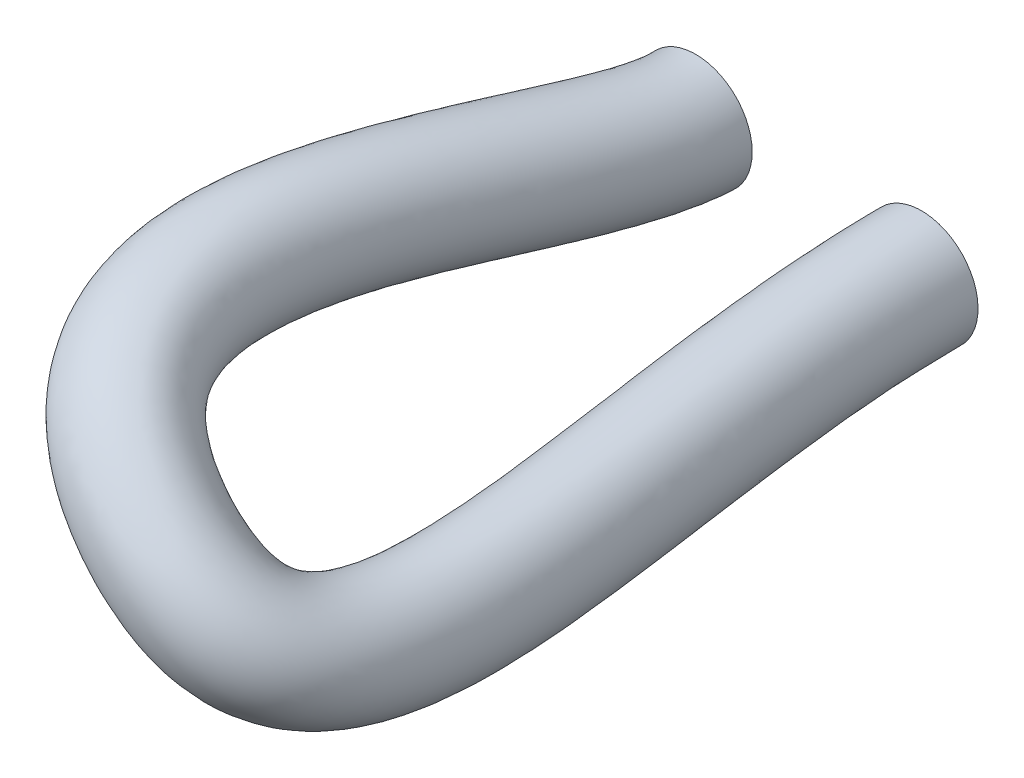
ISO-10303-21;
HEADER;
FILE_DESCRIPTION(('STEP AP214'),'2;1');
FILE_NAME('part.step','',(''),(''),'','','');
FILE_SCHEMA(('AUTOMOTIVE_DESIGN { 1 0 10303 214 1 1 1 1 }'));
ENDSEC;
DATA;
#1=APPLICATION_CONTEXT('core data for automotive mechanical design processes');
#2=APPLICATION_PROTOCOL_DEFINITION('international standard','automotive_design',2000,#1);
#3=PRODUCT_CONTEXT('',#1,'mechanical');
#4=PRODUCT('Part','Part','',(#3));
#5=PRODUCT_RELATED_PRODUCT_CATEGORY('part','',(#4));
#6=PRODUCT_DEFINITION_FORMATION('','',#4);
#7=PRODUCT_DEFINITION_CONTEXT('part definition',#1,'design');
#8=PRODUCT_DEFINITION('design','',#6,#7);
#9=PRODUCT_DEFINITION_SHAPE('','',#8);
#10=(LENGTH_UNIT() NAMED_UNIT(*) SI_UNIT(.MILLI.,.METRE.));
#11=(NAMED_UNIT(*) PLANE_ANGLE_UNIT() SI_UNIT($,.RADIAN.));
#12=(NAMED_UNIT(*) SI_UNIT($,.STERADIAN.) SOLID_ANGLE_UNIT());
#13=UNCERTAINTY_MEASURE_WITH_UNIT(LENGTH_MEASURE(1.E-05),#10,'distance_accuracy_value','');
#14=(GEOMETRIC_REPRESENTATION_CONTEXT(3) GLOBAL_UNCERTAINTY_ASSIGNED_CONTEXT((#13)) GLOBAL_UNIT_ASSIGNED_CONTEXT((#10,
#11,#12)) REPRESENTATION_CONTEXT('',''));
#15=CARTESIAN_POINT('',(0.,0.,0.));
#16=DIRECTION('',(0.,0.,1.));
#17=DIRECTION('',(1.,0.,0.));
#18=AXIS2_PLACEMENT_3D('',#15,#16,#17);
#19=CARTESIAN_POINT('',(3.,-2.49999999999999,-2.00000000000001));
#20=DIRECTION('',(0.,0.,-1.));
#21=DIRECTION('',(-0.180327868852458,0.983606557377049,0.));
#22=AXIS2_PLACEMENT_3D('',#19,#20,#21);
#23=PLANE('',#22);
#24=CARTESIAN_POINT('',(3.,-2.49999999999999,-2.00000000000001));
#25=DIRECTION('',(0.,0.,-1.));
#26=DIRECTION('',(-0.180327868852458,0.983606557377049,0.));
#27=AXIS2_PLACEMENT_3D('',#24,#25,#26);
#28=CIRCLE('',#27,1.);
#29=CARTESIAN_POINT('',(2.81967213114754,-1.51639344262295,-2.00000000000001));
#30=VERTEX_POINT('',#29);
#31=EDGE_CURVE('E85',#30,#30,#28,.T.);
#32=ORIENTED_EDGE('',*,*,#31,.F.);
#33=EDGE_LOOP('',(#32));
#34=FACE_BOUND('',#33,.T.);
#35=CARTESIAN_POINT('',(3.,-2.49999999999999,-2.00000000000001));
#36=DIRECTION('',(0.,0.,-1.));
#37=DIRECTION('',(-0.180327868852458,0.983606557377049,0.));
#38=AXIS2_PLACEMENT_3D('',#35,#36,#37);
#39=CIRCLE('',#38,1.25);
#40=CARTESIAN_POINT('',(2.77459016393442,-1.27049180327868,-2.00000000000001));
#41=VERTEX_POINT('',#40);
#42=EDGE_CURVE('E12',#41,#41,#39,.T.);
#43=ORIENTED_EDGE('',*,*,#42,.T.);
#44=EDGE_LOOP('',(#43));
#45=FACE_BOUND('',#44,.T.);
#46=ADVANCED_FACE('F75',(#34,#45),#23,.T.);
#47=CARTESIAN_POINT('',(0.,0.,0.));
#48=DIRECTION('',(0.,0.,1.));
#49=DIRECTION('',(1.,0.,0.));
#50=AXIS2_PLACEMENT_3D('',#47,#48,#49);
#51=PLANE('',#50);
#52=CARTESIAN_POINT('',(0.,0.,0.));
#53=DIRECTION('',(0.,0.,1.));
#54=DIRECTION('',(1.,0.,0.));
#55=AXIS2_PLACEMENT_3D('',#52,#53,#54);
#56=CIRCLE('',#55,1.);
#57=CARTESIAN_POINT('',(1.,0.,0.));
#58=VERTEX_POINT('',#57);
#59=EDGE_CURVE('E104',#58,#58,#56,.T.);
#60=ORIENTED_EDGE('',*,*,#59,.T.);
#61=EDGE_LOOP('',(#60));
#62=FACE_BOUND('',#61,.T.);
#63=CARTESIAN_POINT('',(0.,0.,0.));
#64=DIRECTION('',(0.,0.,1.));
#65=DIRECTION('',(1.,0.,0.));
#66=AXIS2_PLACEMENT_3D('',#63,#64,#65);
#67=CIRCLE('',#66,1.25);
#68=CARTESIAN_POINT('',(1.25,0.,0.));
#69=VERTEX_POINT('',#68);
#70=EDGE_CURVE('E108',#69,#69,#67,.T.);
#71=ORIENTED_EDGE('',*,*,#70,.F.);
#72=EDGE_LOOP('',(#71));
#73=FACE_BOUND('',#72,.T.);
#74=ADVANCED_FACE('F120',(#62,#73),#51,.F.);
#75=CARTESIAN_POINT('',(1.25,0.,0.));
#76=CARTESIAN_POINT('',(1.24020303916657,0.00816413402786144,0.768878568264969));
#77=CARTESIAN_POINT('',(0.898896629472732,0.292586142106055,2.84512273948862));
#78=CARTESIAN_POINT('',(0.294439810525157,0.796300157895701,5.64556326165292));
#79=CARTESIAN_POINT('',(0.0140658336581799,1.02994513861818,7.68135333235861));
#80=CARTESIAN_POINT('',(-0.0702243336616011,1.100186944718,8.92416247178356));
#81=CARTESIAN_POINT('',(-0.0233685751795636,1.0611404793163,10.0006141813896));
#82=CARTESIAN_POINT('',(0.132172860988602,0.931522615842832,10.6951014262284));
#83=CARTESIAN_POINT('',(0.318106707489525,0.77657774375873,11.1201394015434));
#84=CARTESIAN_POINT('',(0.490826787010012,0.632644344158323,11.3859831856266));
#85=CARTESIAN_POINT('',(0.708844428191528,0.450962976507059,11.6119329131336));
#86=CARTESIAN_POINT('',(0.903290219242124,0.28892481729823,11.7440949847972));
#87=CARTESIAN_POINT('',(1.12471727865323,0.104402267788971,11.8580686514309));
#88=CARTESIAN_POINT('',(1.37741199858499,-0.106176665487493,11.9585785213936));
#89=CARTESIAN_POINT('',(1.76774274302197,-0.431452285851649,12.0365356617491));
#90=CARTESIAN_POINT('',(2.13102806000967,-0.734190050008055,12.0455584944101));
#91=CARTESIAN_POINT('',(2.42374456354038,-0.978120469616982,12.0003935510488));
#92=CARTESIAN_POINT('',(2.57700874273462,-1.10584061894552,11.9425234383298));
#93=CARTESIAN_POINT('',(2.7053481946996,-1.21279016224967,11.8760800494708));
#94=CARTESIAN_POINT('',(2.81156937522793,-1.30130781268994,11.7981592128163));
#95=CARTESIAN_POINT('',(2.95083727723495,-1.41736439769579,11.6359995113662));
#96=CARTESIAN_POINT('',(3.08890691372569,-1.53242242810474,11.376211398493));
#97=CARTESIAN_POINT('',(3.2196966477306,-1.64141387310883,10.9557410714564));
#98=CARTESIAN_POINT('',(3.31663154335312,-1.72219295279427,10.3930045374812));
#99=CARTESIAN_POINT('',(3.42138870466577,-1.80949058722148,9.11555599234882));
#100=CARTESIAN_POINT('',(3.31768140073315,-1.7230678339443,6.58609779115926));
#101=CARTESIAN_POINT('',(2.9406986913543,-1.40891557612858,2.48729408804076));
#102=CARTESIAN_POINT('',(2.77577442028384,-1.27147868356987,-0.514281169093932));
#103=CARTESIAN_POINT('',(2.77459016393443,-1.27049180327869,-2.));
#104=CARTESIAN_POINT('',(1.25,-2.5,0.));
#105=CARTESIAN_POINT('',(1.22387477111084,-2.4782289759257,0.936517851373531));
#106=CARTESIAN_POINT('',(0.849911825305555,-2.16659318775463,3.34804058881431));
#107=CARTESIAN_POINT('',(0.259834477933916,-1.67486206494493,6.02780667160486));
#108=CARTESIAN_POINT('',(0.00319722116493777,-1.46099768430411,7.9090498032411));
#109=CARTESIAN_POINT('',(-0.0672084303151416,-1.40232630807072,8.97489174527888));
#110=CARTESIAN_POINT('',(-0.0262229950640643,-1.43648083744662,9.77366899613816));
#111=CARTESIAN_POINT('',(0.0621322790683926,-1.510110232557,10.1128310640162));
#112=CARTESIAN_POINT('',(0.10665713987183,-1.54721428322653,10.2055897758587));
#113=CARTESIAN_POINT('',(0.122428573150622,-1.56035714429219,10.2284676639448));
#114=CARTESIAN_POINT('',(0.145512677372495,-1.57959389781042,10.2541086937804));
#115=CARTESIAN_POINT('',(0.19475794622898,-1.62063162185749,10.2914541691684));
#116=CARTESIAN_POINT('',(0.284771546175593,-1.69564295514633,10.337261391775));
#117=CARTESIAN_POINT('',(0.414243357776562,-1.80353613148047,10.3909644679286));
#118=CARTESIAN_POINT('',(0.650160049363869,-2.0001333744699,10.4381608573673));
#119=CARTESIAN_POINT('',(0.849999004579342,-2.16666583714945,10.4420763458307));
#120=CARTESIAN_POINT('',(0.970900256124899,-2.26741688010408,10.4195906831583));
#121=CARTESIAN_POINT('',(0.969675001200082,-2.2663958343334,10.4152673267401));
#122=CARTESIAN_POINT('',(0.934324119355849,-2.23693676612988,10.4344287204243));
#123=CARTESIAN_POINT('',(0.86085630844649,-2.17571359037208,10.4828625593363));
#124=CARTESIAN_POINT('',(0.772327022238426,-2.10193918519869,10.5927876554624));
#125=CARTESIAN_POINT('',(0.754077887527748,-2.08673157293979,10.6469560459897));
#126=CARTESIAN_POINT('',(0.805181348079497,-2.12931779006625,10.505847367194));
#127=CARTESIAN_POINT('',(0.869154355028941,-2.18262862919079,10.1511859702122));
#128=CARTESIAN_POINT('',(0.954821648582511,-2.25401804048542,9.14791728189885));
#129=CARTESIAN_POINT('',(0.867908543074272,-2.1815904525619,6.7598365896531));
#130=CARTESIAN_POINT('',(0.487603579658757,-1.86466964971563,2.67043433304914));
#131=CARTESIAN_POINT('',(0.318731787423581,-1.72394315618632,-0.453234420757806));
#132=CARTESIAN_POINT('',(0.315573770491804,-1.72131147540983,-2.));
#133=CARTESIAN_POINT('',(-1.25,-2.5,0.));
#134=CARTESIAN_POINT('',(-1.25653130722229,-2.49455724398142,0.735350711643256));
#135=CARTESIAN_POINT('',(-1.59130640969384,-2.2155779919218,2.74453916962349));
#136=CARTESIAN_POINT('',(-2.1986391229566,-1.70946739753616,5.56911457966253));
#137=CARTESIAN_POINT('',(-2.48376044384317,-1.47186629679735,7.63581403818211));
#138=CARTESIAN_POINT('',(-2.5708275143309,-1.39931040472425,8.9140166170845));
#139=CARTESIAN_POINT('',(-2.52279769120267,-1.43933525733111,10.0460032184399));
#140=CARTESIAN_POINT('',(-2.35381902262736,-1.5801508144772,10.8115554986709));
#141=CARTESIAN_POINT('',(-2.13960337898694,-1.75866385084422,11.3030493266804));
#142=CARTESIAN_POINT('',(-1.93549357021811,-1.92875535815157,11.6174862899629));
#143=CARTESIAN_POINT('',(-1.67848922164467,-2.14292564862944,11.8834977570042));
#144=CARTESIAN_POINT('',(-1.45500332615525,-2.32916389487063,12.034623147923));
#145=CARTESIAN_POINT('',(-1.20729357485124,-2.53558868762397,12.1622301033621));
#146=CARTESIAN_POINT('',(-0.929954273253328,-2.76670477228889,12.2721013320866));
#147=CARTESIAN_POINT('',(-0.508740718246404,-3.117716068128,12.3562106226255));
#148=CARTESIAN_POINT('',(-0.112766128904267,-3.44769489257978,12.3662549241259));
#149=CARTESIAN_POINT('',(0.214313425023474,-3.72026118751956,12.3165541246269));
#150=CARTESIAN_POINT('',(0.398475491041527,-3.87372957586794,12.2479746606478));
#151=CARTESIAN_POINT('',(0.559553009768353,-4.00796084147363,12.1644103152802));
#152=CARTESIAN_POINT('',(0.701711988584213,-4.12642665715351,12.0612185435123));
#153=CARTESIAN_POINT('',(0.886539328234254,-4.28044944019521,11.844641882547));
#154=CARTESIAN_POINT('',(1.05587271896528,-4.42156059913773,11.5220624689936));
#155=CARTESIAN_POINT('',(1.20259970766082,-4.54383308971735,11.0457198123088));
#156=CARTESIAN_POINT('',(1.30612698101796,-4.63010581751497,10.4413682509349));
#157=CARTESIAN_POINT('',(1.41470211588242,-4.72058509656868,9.10908373443881));
#158=CARTESIAN_POINT('',(1.30763597226493,-4.63136331022078,6.55135003146048));
#159=CARTESIAN_POINT('',(0.931317713693406,-4.31776476141117,2.45066603903909));
#160=CARTESIAN_POINT('',(0.767182946855894,-4.18098578904658,-0.526490518761158));
#161=CARTESIAN_POINT('',(0.766393442622949,-4.18032786885246,-2.));
#162=CARTESIAN_POINT('',(-1.25,0.,0.));
#163=CARTESIAN_POINT('',(-1.24020303916657,-0.0081641340278612,0.567711428534694));
#164=CARTESIAN_POINT('',(-1.54232160552666,0.243601337938887,2.2416213202978));
#165=CARTESIAN_POINT('',(-2.16403379036536,0.76169482530447,5.18687116971059));
#166=CARTESIAN_POINT('',(-2.47289183134993,1.01907652612495,7.40811756729961));
#167=CARTESIAN_POINT('',(-2.57384341767736,1.10320284806447,8.86328734358919));
#168=CARTESIAN_POINT('',(-2.51994327131817,1.05828605943181,10.2729484036914));
#169=CARTESIAN_POINT('',(-2.28377844070715,0.861482033922632,11.3938258608831));
#170=CARTESIAN_POINT('',(-1.92815381136925,0.565128176141043,12.2175989523651));
#171=CARTESIAN_POINT('',(-1.56709535635872,0.26424613029894,12.7750018116447));
#172=CARTESIAN_POINT('',(-1.11515747082563,-0.112368774311967,13.2413219763573));
#173=CARTESIAN_POINT('',(-0.746471053142106,-0.419607455714909,13.4872639635517));
#174=CARTESIAN_POINT('',(-0.367347842373599,-0.735543464688665,13.6830373630179));
#175=CARTESIAN_POINT('',(0.0332143675550992,-1.06934530629591,13.8397153855516));
#176=CARTESIAN_POINT('',(0.608841975411702,-1.54903497950975,13.9545854270074));
#177=CARTESIAN_POINT('',(1.16826292652606,-2.01521910543838,13.9697370727053));
#178=CARTESIAN_POINT('',(1.66715773243895,-2.43096477703246,13.8973569925174));
#179=CARTESIAN_POINT('',(2.00580923257606,-2.71317436048005,13.7752307722375));
#180=CARTESIAN_POINT('',(2.3305770851121,-2.98381423759342,13.6060616443267));
#181=CARTESIAN_POINT('',(2.65242505536565,-3.25202087947138,13.3765151969923));
#182=CARTESIAN_POINT('',(3.06504958323078,-3.59587465269232,12.8878537384508));
#183=CARTESIAN_POINT('',(3.39070174516322,-3.86725145430269,12.2513178214969));
#184=CARTESIAN_POINT('',(3.61711500731192,-4.05592917275993,11.4956135165712));
#185=CARTESIAN_POINT('',(3.75360416934215,-4.16967014111846,10.6831868182039));
#186=CARTESIAN_POINT('',(3.88126917196568,-4.27605764330474,9.07672244488877));
#187=CARTESIAN_POINT('',(3.75740882992382,-4.17284069160318,6.37761123296665));
#188=CARTESIAN_POINT('',(3.38441282538895,-3.86201068782412,2.26752579403071));
#189=CARTESIAN_POINT('',(3.22422557971616,-3.72852131643013,-0.587537267097285));
#190=CARTESIAN_POINT('',(3.22540983606557,-3.72950819672131,-2.));
#191=CARTESIAN_POINT('',(-1.25,2.5,0.));
#192=CARTESIAN_POINT('',(-1.22387477111084,2.4782289759257,0.400072145426132));
#193=CARTESIAN_POINT('',(-1.49333680135948,2.70278066779958,1.73870347097211));
#194=CARTESIAN_POINT('',(-2.12942845777412,3.23285704814511,4.80462775975865));
#195=CARTESIAN_POINT('',(-2.46202321885669,3.51001934904725,7.18042109641712));
#196=CARTESIAN_POINT('',(-2.57685932102382,3.60571610085319,8.81255807009388));
#197=CARTESIAN_POINT('',(-2.51708885143367,3.55590737619473,10.4998935889428));
#198=CARTESIAN_POINT('',(-2.21373785878694,3.30311488232246,11.9760962230953));
#199=CARTESIAN_POINT('',(-1.71670424375155,2.8889202031263,13.1321485780498));
#200=CARTESIAN_POINT('',(-1.19869714249933,2.45724761874945,13.9325173333266));
#201=CARTESIAN_POINT('',(-0.551825720006602,1.91818810000551,14.5991461957105));
#202=CARTESIAN_POINT('',(-0.0379387801289622,1.48994898344081,14.9399047791805));
#203=CARTESIAN_POINT('',(0.472597890104043,1.06450175824664,15.2038446226738));
#204=CARTESIAN_POINT('',(0.996383008363526,0.628014159697069,15.4073294390165));
#205=CARTESIAN_POINT('',(1.72642466906981,0.0196461091085027,15.5529602313892));
#206=CARTESIAN_POINT('',(2.44929198195638,-0.58274331829699,15.5732192212847));
#207=CARTESIAN_POINT('',(3.12000203985443,-1.14166836654536,15.4781598604079));
#208=CARTESIAN_POINT('',(3.6131429741106,-1.55261914509217,15.3024868838272));
#209=CARTESIAN_POINT('',(4.10160116045586,-1.95966763371321,15.0477129733733));
#210=CARTESIAN_POINT('',(4.60313812214708,-2.37761510178924,14.6918118504724));
#211=CARTESIAN_POINT('',(5.2435598382273,-2.91129986518942,13.9310655943547));
#212=CARTESIAN_POINT('',(5.72553077136116,-3.31294230946764,12.9805731740001));
#213=CARTESIAN_POINT('',(6.03163030696302,-3.56802525580252,11.9455072208335));
#214=CARTESIAN_POINT('',(6.20108135766633,-3.70923446472194,10.9250053854729));
#215=CARTESIAN_POINT('',(6.34783622804894,-3.83153019004079,9.04436115533874));
#216=CARTESIAN_POINT('',(6.2071816875827,-3.71431807298558,6.2038724344728));
#217=CARTESIAN_POINT('',(5.83750793708448,-3.40625661423707,2.08438554902233));
#218=CARTESIAN_POINT('',(5.68126821257642,-3.27605684381368,-0.648584015433411));
#219=CARTESIAN_POINT('',(5.68442622950819,-3.27868852459017,-2.));
#220=CARTESIAN_POINT('',(1.25,2.5,0.));
#221=CARTESIAN_POINT('',(1.25653130722229,2.49455724398142,0.601239285156407));
#222=CARTESIAN_POINT('',(0.947881433639909,2.75176547196675,2.34220489016294));
#223=CARTESIAN_POINT('',(0.329045143116398,3.26746238073634,5.26331985170098));
#224=CARTESIAN_POINT('',(0.024934446151422,3.52088796154048,7.45365686147611));
#225=CARTESIAN_POINT('',(-0.0732402370080603,3.60270019750672,8.87343319828825));
#226=CARTESIAN_POINT('',(-0.0205141552950631,3.55876179607922,10.2275593666411));
#227=CARTESIAN_POINT('',(0.202213442908811,3.37315546424266,11.2773717884406));
#228=CARTESIAN_POINT('',(0.529556275107219,3.10036977074399,12.0346890272282));
#229=CARTESIAN_POINT('',(0.859225000869402,2.82564583260883,12.5434987073084));
#230=CARTESIAN_POINT('',(1.27217617901056,2.48151985082454,12.9697571324867));
#231=CARTESIAN_POINT('',(1.61182249225527,2.19848125645395,13.196735800426));
#232=CARTESIAN_POINT('',(1.96466301113088,1.90444749072427,13.3788759110868));
#233=CARTESIAN_POINT('',(2.34058063939341,1.59118280050549,13.5261925748586));
#234=CARTESIAN_POINT('',(2.88532543668008,1.1372288027666,13.634910466131));
#235=CARTESIAN_POINT('',(3.41205711543999,0.698285737133338,13.6490406429895));
#236=CARTESIAN_POINT('',(3.87658887095586,0.311175940870117,13.5811964189393));
#237=CARTESIAN_POINT('',(4.18434248426915,0.05471459644237,13.4697795499195));
#238=CARTESIAN_POINT('',(4.47637227004335,-0.188643558369462,13.3177313785174));
#239=CARTESIAN_POINT('',(4.76228244200936,-0.426902035007801,13.1134558662963));
#240=CARTESIAN_POINT('',(5.12934753223147,-0.732789610192894,12.6792113672701));
#241=CARTESIAN_POINT('',(5.42373593992363,-0.978113283269694,12.1054667509962));
#242=CARTESIAN_POINT('',(5.6342119473817,-1.15350995615142,11.4056347757187));
#243=CARTESIAN_POINT('',(5.76410873167731,-1.26175727639776,10.6348231047501));
#244=CARTESIAN_POINT('',(5.88795576074903,-1.36496313395753,9.08319470279878));
#245=CARTESIAN_POINT('',(5.76745425839204,-1.2645452153267,6.41235899266541));
#246=CARTESIAN_POINT('',(5.39379380304984,-0.953161502541533,2.30415384303238));
#247=CARTESIAN_POINT('',(5.2328170531441,-0.819014210953421,-0.575327917430059));
#248=CARTESIAN_POINT('',(5.23360655737705,-0.819672131147543,-2.));
#249=CARTESIAN_POINT('',(1.25,0.,0.));
#250=CARTESIAN_POINT('',(1.24020303916657,0.00816413402786144,0.768878568264969));
#251=CARTESIAN_POINT('',(0.898896629472732,0.292586142106055,2.84512273948862));
#252=CARTESIAN_POINT('',(0.294439810525157,0.796300157895701,5.64556326165292));
#253=CARTESIAN_POINT('',(0.0140658336581799,1.02994513861818,7.68135333235861));
#254=CARTESIAN_POINT('',(-0.0702243336616011,1.100186944718,8.92416247178356));
#255=CARTESIAN_POINT('',(-0.0233685751795636,1.0611404793163,10.0006141813896));
#256=CARTESIAN_POINT('',(0.132172860988602,0.931522615842832,10.6951014262284));
#257=CARTESIAN_POINT('',(0.318106707489525,0.77657774375873,11.1201394015434));
#258=CARTESIAN_POINT('',(0.490826787010012,0.632644344158323,11.3859831856266));
#259=CARTESIAN_POINT('',(0.708844428191528,0.450962976507059,11.6119329131336));
#260=CARTESIAN_POINT('',(0.903290219242124,0.28892481729823,11.7440949847972));
#261=CARTESIAN_POINT('',(1.12471727865323,0.104402267788971,11.8580686514309));
#262=CARTESIAN_POINT('',(1.37741199858499,-0.106176665487493,11.9585785213936));
#263=CARTESIAN_POINT('',(1.76774274302197,-0.431452285851649,12.0365356617491));
#264=CARTESIAN_POINT('',(2.13102806000967,-0.734190050008055,12.0455584944101));
#265=CARTESIAN_POINT('',(2.42374456354038,-0.978120469616982,12.0003935510488));
#266=CARTESIAN_POINT('',(2.57700874273462,-1.10584061894552,11.9425234383298));
#267=CARTESIAN_POINT('',(2.7053481946996,-1.21279016224967,11.8760800494708));
#268=CARTESIAN_POINT('',(2.81156937522793,-1.30130781268994,11.7981592128163));
#269=CARTESIAN_POINT('',(2.95083727723495,-1.41736439769579,11.6359995113662));
#270=CARTESIAN_POINT('',(3.08890691372569,-1.53242242810474,11.376211398493));
#271=CARTESIAN_POINT('',(3.2196966477306,-1.64141387310883,10.9557410714564));
#272=CARTESIAN_POINT('',(3.31663154335312,-1.72219295279427,10.3930045374812));
#273=CARTESIAN_POINT('',(3.42138870466577,-1.80949058722148,9.11555599234882));
#274=CARTESIAN_POINT('',(3.31768140073315,-1.7230678339443,6.58609779115926));
#275=CARTESIAN_POINT('',(2.9406986913543,-1.40891557612858,2.48729408804076));
#276=CARTESIAN_POINT('',(2.77577442028384,-1.27147868356987,-0.514281169093932));
#277=CARTESIAN_POINT('',(2.77459016393443,-1.27049180327869,-2.));
#278=(BOUNDED_SURFACE() B_SPLINE_SURFACE(3,3,((#75,#76,#77,#78,#79,#80,#81,#82,#83,#84,#85,#86,
#87,#88,#89,#90,#91,#92,#93,#94,#95,#96,#97,#98,#99,#100,#101,#102,#103),(#104,#105,#106,#107,
#108,#109,#110,#111,#112,#113,#114,#115,#116,#117,#118,#119,#120,#121,#122,#123,#124,#125,#126,
#127,#128,#129,#130,#131,#132),(#133,#134,#135,#136,#137,#138,#139,#140,#141,#142,#143,#144,
#145,#146,#147,#148,#149,#150,#151,#152,#153,#154,#155,#156,#157,#158,#159,#160,#161),(#162,
#163,#164,#165,#166,#167,#168,#169,#170,#171,#172,#173,#174,#175,#176,#177,#178,#179,#180,#181,
#182,#183,#184,#185,#186,#187,#188,#189,#190),(#191,#192,#193,#194,#195,#196,#197,#198,#199,
#200,#201,#202,#203,#204,#205,#206,#207,#208,#209,#210,#211,#212,#213,#214,#215,#216,#217,#218,
#219),(#220,#221,#222,#223,#224,#225,#226,#227,#228,#229,#230,#231,#232,#233,#234,#235,#236,
#237,#238,#239,#240,#241,#242,#243,#244,#245,#246,#247,#248),(#249,#250,#251,#252,#253,#254,
#255,#256,#257,#258,#259,#260,#261,#262,#263,#264,#265,#266,#267,#268,#269,#270,#271,#272,#273,
#274,#275,#276,#277)),.UNSPECIFIED.,.T.,.F.,.F.) B_SPLINE_SURFACE_WITH_KNOTS((4,3,4),(4,1,1,1,1,
1,1,1,1,1,1,1,1,1,1,1,1,1,1,1,1,1,1,1,1,1,4),(0.,0.5,1.),(0.,0.118125,0.23625,0.28265625,
0.329062499999999,0.37546875,0.421874999999912,0.4453125,0.468750000000011,0.4921875,0.515625,
0.51722955361672,0.5390625,0.5625,0.581249999999996,0.6,0.61722955361672,0.61875,0.6375,0.65625,
0.679687500000002,0.703125,0.726562500000153,0.750000000000002,0.833333333333333,
0.916666666666667,1.),
.UNSPECIFIED.) GEOMETRIC_REPRESENTATION_ITEM() RATIONAL_B_SPLINE_SURFACE(((1.,1.,1.,1.,1.,1.,1.,
1.,1.,1.,1.,1.,1.,1.,1.,1.,1.,1.,1.,0.999999999999999,1.,1.,1.,1.,1.,1.,1.,1.,1.),
(0.333333333333333,0.333333333333333,0.333333333333333,0.333333333333333,0.333333333333333,
0.333333333333333,0.333333333333333,0.333333333333333,0.333333333333333,0.333333333333333,
0.333333333333333,0.333333333333333,0.333333333333333,0.333333333333333,0.333333333333333,
0.333333333333333,0.333333333333333,0.333333333333333,0.333333333333333,0.333333333333333,
0.333333333333333,0.333333333333333,0.333333333333333,0.333333333333333,0.333333333333333,
0.333333333333333,0.333333333333333,0.333333333333333,0.333333333333333),(0.333333333333333,
0.333333333333333,0.333333333333333,0.333333333333333,0.333333333333333,0.333333333333333,
0.333333333333333,0.333333333333333,0.333333333333333,0.333333333333333,0.333333333333333,
0.333333333333333,0.333333333333333,0.333333333333333,0.333333333333333,0.333333333333333,
0.333333333333333,0.333333333333333,0.333333333333333,0.333333333333333,0.333333333333333,
0.333333333333333,0.333333333333333,0.333333333333333,0.333333333333333,0.333333333333333,
0.333333333333333,0.333333333333333,0.333333333333333),(1.,1.,1.,1.,1.,1.,1.,1.,1.,1.,1.,1.,1.,
1.,1.,1.,1.,1.,1.,0.999999999999999,1.,1.,1.,1.,1.,1.,1.,1.,1.),(0.333333333333333,
0.333333333333333,0.333333333333333,0.333333333333333,0.333333333333333,0.333333333333333,
0.333333333333333,0.333333333333333,0.333333333333333,0.333333333333333,0.333333333333333,
0.333333333333333,0.333333333333333,0.333333333333333,0.333333333333333,0.333333333333333,
0.333333333333333,0.333333333333333,0.333333333333333,0.333333333333333,0.333333333333333,
0.333333333333333,0.333333333333333,0.333333333333333,0.333333333333333,0.333333333333333,
0.333333333333333,0.333333333333333,0.333333333333333),(0.333333333333333,0.333333333333333,
0.333333333333333,0.333333333333333,0.333333333333333,0.333333333333333,0.333333333333333,
0.333333333333333,0.333333333333333,0.333333333333333,0.333333333333333,0.333333333333333,
0.333333333333333,0.333333333333333,0.333333333333333,0.333333333333333,0.333333333333333,
0.333333333333333,0.333333333333333,0.333333333333333,0.333333333333333,0.333333333333333,
0.333333333333333,0.333333333333333,0.333333333333333,0.333333333333333,0.333333333333333,
0.333333333333333,0.333333333333333),(1.,1.,1.,1.,1.,1.,1.,1.,1.,1.,1.,1.,1.,1.,1.,1.,1.,1.,1.,
0.999999999999999,1.,1.,1.,1.,1.,1.,1.,1.,1.))) REPRESENTATION_ITEM('') SURFACE());
#279=CARTESIAN_POINT('',(1.25,0.,0.));
#280=CARTESIAN_POINT('',(1.24020303916657,0.00816413402786144,0.768878568264969));
#281=CARTESIAN_POINT('',(0.898896629472732,0.292586142106055,2.84512273948862));
#282=CARTESIAN_POINT('',(0.294439810525157,0.796300157895701,5.64556326165292));
#283=CARTESIAN_POINT('',(0.0140658336581799,1.02994513861818,7.68135333235861));
#284=CARTESIAN_POINT('',(-0.0702243336616011,1.100186944718,8.92416247178356));
#285=CARTESIAN_POINT('',(-0.0233685751795636,1.0611404793163,10.0006141813896));
#286=CARTESIAN_POINT('',(0.132172860988602,0.931522615842832,10.6951014262284));
#287=CARTESIAN_POINT('',(0.318106707489525,0.77657774375873,11.1201394015434));
#288=CARTESIAN_POINT('',(0.490826787010012,0.632644344158323,11.3859831856266));
#289=CARTESIAN_POINT('',(0.708844428191528,0.450962976507059,11.6119329131336));
#290=CARTESIAN_POINT('',(0.903290219242124,0.28892481729823,11.7440949847972));
#291=CARTESIAN_POINT('',(1.12471727865323,0.104402267788971,11.8580686514309));
#292=CARTESIAN_POINT('',(1.37741199858499,-0.106176665487493,11.9585785213936));
#293=CARTESIAN_POINT('',(1.76774274302197,-0.431452285851649,12.0365356617491));
#294=CARTESIAN_POINT('',(2.13102806000967,-0.734190050008055,12.0455584944101));
#295=CARTESIAN_POINT('',(2.42374456354038,-0.978120469616982,12.0003935510488));
#296=CARTESIAN_POINT('',(2.57700874273462,-1.10584061894552,11.9425234383298));
#297=CARTESIAN_POINT('',(2.7053481946996,-1.21279016224967,11.8760800494708));
#298=CARTESIAN_POINT('',(2.81156937522793,-1.30130781268994,11.7981592128163));
#299=CARTESIAN_POINT('',(2.95083727723495,-1.41736439769579,11.6359995113662));
#300=CARTESIAN_POINT('',(3.08890691372569,-1.53242242810474,11.376211398493));
#301=CARTESIAN_POINT('',(3.2196966477306,-1.64141387310883,10.9557410714564));
#302=CARTESIAN_POINT('',(3.31663154335312,-1.72219295279427,10.3930045374812));
#303=CARTESIAN_POINT('',(3.42138870466577,-1.80949058722148,9.11555599234882));
#304=CARTESIAN_POINT('',(3.31768140073315,-1.7230678339443,6.58609779115926));
#305=CARTESIAN_POINT('',(2.9406986913543,-1.40891557612858,2.48729408804076));
#306=CARTESIAN_POINT('',(2.77577442028384,-1.27147868356987,-0.514281169093932));
#307=CARTESIAN_POINT('',(2.77459016393443,-1.27049180327869,-2.));
#308=B_SPLINE_CURVE_WITH_KNOTS('',3,(#279,#280,#281,#282,#283,#284,#285,#286,#287,#288,#289,
#290,#291,#292,#293,#294,#295,#296,#297,#298,#299,#300,#301,#302,#303,#304,#305,#306,#307),
.UNSPECIFIED.,.F.,.F.,(4,1,1,1,1,1,1,1,1,1,1,1,1,1,1,1,1,1,1,1,1,1,1,1,1,1,4),(0.,0.118125,
0.23625,0.28265625,0.329062499999999,0.37546875,0.421874999999912,0.4453125,0.468750000000011,
0.4921875,0.515625,0.51722955361672,0.5390625,0.5625,0.581249999999996,0.6,0.61722955361672,
0.61875,0.6375,0.65625,0.679687500000002,0.703125,0.726562500000153,0.750000000000002,
0.833333333333333,0.916666666666667,1.),.UNSPECIFIED.);
#309=EDGE_CURVE('E78',#69,#41,#308,.T.);
#310=ORIENTED_EDGE('',*,*,#70,.T.);
#311=ORIENTED_EDGE('',*,*,#309,.T.);
#312=ORIENTED_EDGE('',*,*,#42,.F.);
#313=ORIENTED_EDGE('',*,*,#309,.F.);
#314=EDGE_LOOP('',(#310,#311,#312,#313));
#315=FACE_BOUND('',#314,.T.);
#316=ADVANCED_FACE('F118',(#315),#278,.F.);
#317=CARTESIAN_POINT('',(1.,0.,0.));
#318=CARTESIAN_POINT('',(0.992162431333253,0.00653130722228919,0.748761854291941));
#319=CARTESIAN_POINT('',(0.654774805972792,0.287687661689339,2.78477259756954));
#320=CARTESIAN_POINT('',(0.0485924504361055,0.792839624636578,5.59969405245869));
#321=CARTESIAN_POINT('',(-0.234629932842632,1.02885827736886,7.65402975585271));
#322=CARTESIAN_POINT('',(-0.320586242063177,1.10048853505265,8.91807495896413));
#323=CARTESIAN_POINT('',(-0.273026044793424,1.06085503732785,10.0278476036198));
#324=CARTESIAN_POINT('',(-0.109422269180974,0.924518557650812,10.7649738696939));
#325=CARTESIAN_POINT('',(0.0934806556036475,0.755432786996961,11.2298853566256));
#326=CARTESIAN_POINT('',(0.285034572673139,0.595804522772384,11.5248850482284));
#327=CARTESIAN_POINT('',(0.526444238289812,0.394629801425157,11.774871819456));
#328=CARTESIAN_POINT('',(0.738314092003701,0.218071589996916,11.9184118826727));
#329=CARTESIAN_POINT('',(0.975510766550551,0.0204076945412074,12.0405655225896));
#330=CARTESIAN_POINT('',(1.242992235482,-0.202493529568335,12.1466922078094));
#331=CARTESIAN_POINT('',(1.65185266626095,-0.543210555217459,12.2283406382749));
#332=CARTESIAN_POINT('',(2.03475154666131,-0.862292955551088,12.2379763522396));
#333=CARTESIAN_POINT('',(2.34808588043024,-1.12340490035853,12.1900898951957));
#334=CARTESIAN_POINT('',(2.51988879171876,-1.26657399309897,12.1257941717206));
#335=CARTESIAN_POINT('',(2.66787108374085,-1.38989256978404,12.0490782089564));
#336=CARTESIAN_POINT('',(2.7956549432417,-1.49637911936808,11.9559948112339));
#337=CARTESIAN_POINT('',(2.96225850783453,-1.63521542319544,11.7611849340747));
#338=CARTESIAN_POINT('',(3.11908639686944,-1.76590533072454,11.4637220407934));
#339=CARTESIAN_POINT('',(3.25943848368873,-1.88286540307394,11.0097283159678));
#340=CARTESIAN_POINT('',(3.36032880595203,-1.96694067162669,10.4220227655534));
#341=CARTESIAN_POINT('',(3.46737675139576,-2.0561472928298,9.11167263760281));
#342=CARTESIAN_POINT('',(3.36165414365222,-1.96804511971019,6.56524913534));
#343=CARTESIAN_POINT('',(2.98507010475776,-1.65422508729814,2.46531725863976));
#344=CARTESIAN_POINT('',(2.82061953622707,-1.51718294685589,-0.521606778894267));
#345=CARTESIAN_POINT('',(2.81967213114754,-1.51639344262295,-2.));
#346=CARTESIAN_POINT('',(1.,-2.,0.));
#347=CARTESIAN_POINT('',(0.979099816888672,-1.98258318074056,0.882873280778791));
#348=CARTESIAN_POINT('',(0.615586962639051,-1.67965580219921,3.18710687703009));
#349=CARTESIAN_POINT('',(0.0209081843631124,-1.18409015363593,5.90548878042024));
#350=CARTESIAN_POINT('',(-0.243324822837225,-0.963895980968979,7.8361869325587));
#351=CARTESIAN_POINT('',(-0.318173519386009,-0.901522067178329,8.95865837776038));
#352=CARTESIAN_POINT('',(-0.275309580701025,-0.937242016082481,9.84629145541863));
#353=CARTESIAN_POINT('',(-0.165454734717141,-1.02878772106905,10.2991575799241));
#354=CARTESIAN_POINT('',(-0.075678998490508,-1.10360083459124,10.4982456560778));
#355=CARTESIAN_POINT('',(-0.00968399841437314,-1.15859666798802,10.598872630883));
#356=CARTESIAN_POINT('',(0.0757788376345854,-1.22981569802882,10.6886124439734));
#357=CARTESIAN_POINT('',(0.171488273593186,-1.30957356132766,10.7562992301696));
#358=CARTESIAN_POINT('',(0.303554180568438,-1.41962848380703,10.8239197148649));
#359=CARTESIAN_POINT('',(0.472457322835259,-1.56038110236272,10.8926009650374));
#360=CARTESIAN_POINT('',(0.757786511334463,-1.79815542611206,10.9496407947695));
#361=CARTESIAN_POINT('',(1.00992830231705,-2.0082735852642,10.9551906333761));
#362=CARTESIAN_POINT('',(1.18581043449785,-2.15484202874821,10.9254476008833));
#363=CARTESIAN_POINT('',(1.23402179849113,-2.19501816540928,10.9039892824488));
#364=CARTESIAN_POINT('',(1.25105182346585,-2.20920985288821,10.8957571457192));
#365=CARTESIAN_POINT('',(1.23508448981655,-2.19590374151379,10.9037574884499));
#366=CARTESIAN_POINT('',(1.21945030383731,-2.18287525319776,10.9266154493516));
#367=CARTESIAN_POINT('',(1.25122317591109,-2.20935264659258,10.8803177587908));
#368=CARTESIAN_POINT('',(1.32782624396785,-2.27318853663987,10.649813352558));
#369=CARTESIAN_POINT('',(1.40234705529268,-2.3352892127439,10.2285679117383));
#370=CARTESIAN_POINT('',(1.49412310652915,-2.41176925544096,9.13756166924284));
#371=CARTESIAN_POINT('',(1.40183585752512,-2.33486321460427,6.70424017413507));
#372=CARTESIAN_POINT('',(1.02259401540133,-2.01882834616778,2.61182945464646));
#373=CARTESIAN_POINT('',(0.854985429938864,-1.87915452494905,-0.472769380225366));
#374=CARTESIAN_POINT('',(0.852459016393443,-1.87704918032787,-2.));
#375=CARTESIAN_POINT('',(-1.,-2.,0.));
#376=CARTESIAN_POINT('',(-1.00522504577783,-1.99564579518514,0.721939568994571));
#377=CARTESIAN_POINT('',(-1.33738762536046,-1.71884364553295,2.70430574167743));
#378=CARTESIAN_POINT('',(-1.9458706963493,-1.21177441970892,5.53853510686638));
#379=CARTESIAN_POINT('',(-2.23289095484371,-0.972590870963568,7.61759832051151));
#380=CARTESIAN_POINT('',(-2.32106878659862,-0.899109344501153,8.90995827520488));
#381=CARTESIAN_POINT('',(-2.27256933761191,-0.939525551990075,10.06415883326));
#382=CARTESIAN_POINT('',(-2.09821577607374,-1.08482018660521,10.8581371276478));
#383=CARTESIAN_POINT('',(-1.87268741357752,-1.27276048868539,11.3762132967352));
#384=CARTESIAN_POINT('',(-1.65602171310936,-1.45331523907553,11.7100875316975));
#385=CARTESIAN_POINT('',(-1.38342268157914,-1.68048109868404,11.9921236945525));
#386=CARTESIAN_POINT('',(-1.1483207443142,-1.87639937973817,12.1508344131733));
#387=CARTESIAN_POINT('',(-0.890097916253029,-2.09158506978914,12.2838946841345));
#388=CARTESIAN_POINT('',(-0.602900781988653,-2.33091601500946,12.3975104563638));
#389=CARTESIAN_POINT('',(-0.169334102753756,-2.69222158103854,12.4840806069761));
#390=CARTESIAN_POINT('',(0.239716195530159,-3.03309682960846,12.4945334960123));
#391=CARTESIAN_POINT('',(0.580540969616712,-3.31711747468059,12.4430183540581));
#392=CARTESIAN_POINT('',(0.77706219036429,-3.48088515863691,12.370155149575));
#393=CARTESIAN_POINT('',(0.951234935795852,-3.62602911316321,12.2797424216039));
#394=CARTESIAN_POINT('',(1.10776903392673,-3.75647419493894,12.1664422757907));
#395=CARTESIAN_POINT('',(1.31082014863398,-3.92568345719498,11.9280988310193));
#396=CARTESIAN_POINT('',(1.49265904106111,-4.07721586755093,11.5804028971939));
#397=CARTESIAN_POINT('',(1.6457609316329,-4.20480077636075,11.0817113086498));
#398=CARTESIAN_POINT('',(1.7519251560839,-4.29327096340325,10.4607137363165));
#399=CARTESIAN_POINT('',(1.86202748036908,-4.38502290030757,9.10649483127481));
#400=CARTESIAN_POINT('',(1.75361780087764,-4.29468150073137,6.53745092758098));
#401=CARTESIAN_POINT('',(1.37756532262905,-3.98130443552421,2.43601481943842));
#402=CARTESIAN_POINT('',(1.21374635748471,-3.84478863123726,-0.531374258628048));
#403=CARTESIAN_POINT('',(1.21311475409836,-3.84426229508197,-2.));
#404=CARTESIAN_POINT('',(-1.,0.,0.));
#405=CARTESIAN_POINT('',(-0.992162431333253,-0.00653130722228897,0.587828142507721));
#406=CARTESIAN_POINT('',(-1.29819978202672,0.248499818355604,2.30197146221688));
#407=CARTESIAN_POINT('',(-1.91818643027631,0.765155358563594,5.23274037890482));
#408=CARTESIAN_POINT('',(-2.22419606484912,1.02016338737427,7.43544114380551));
#409=CARTESIAN_POINT('',(-2.32348150927578,1.10290125772982,8.86937485640863));
#410=CARTESIAN_POINT('',(-2.27028580170431,1.05857150142026,10.2457149814612));
#411=CARTESIAN_POINT('',(-2.04218331053758,0.868486092114652,11.3239534174176));
#412=CARTESIAN_POINT('',(-1.70352775948337,0.586273132902811,12.1078529972829));
#413=CARTESIAN_POINT('',(-1.36130314202185,0.301085951684879,12.6360999490429));
#414=CARTESIAN_POINT('',(-0.932757280923918,-0.0560355992300642,13.078383070035));
#415=CARTESIAN_POINT('',(-0.581494925903683,-0.348754228413595,13.3129470656763));
#416=CARTESIAN_POINT('',(-0.218141330270915,-0.651548891440902,13.5005404918592));
#417=CARTESIAN_POINT('',(0.167634130658088,-0.973028442215071,13.6516016991358));
#418=CARTESIAN_POINT('',(0.724732052172729,-1.43727671014394,13.7627804504815));
#419=CARTESIAN_POINT('',(1.26453943987442,-1.88711619989535,13.7773192148758));
#420=CARTESIAN_POINT('',(1.7428164155491,-2.28568034629091,13.7076606483705));
#421=CARTESIAN_POINT('',(2.06292918359192,-2.5524409863266,13.5919600388467));
#422=CARTESIAN_POINT('',(2.36805419607085,-2.80671183005905,13.4330634848411));
#423=CARTESIAN_POINT('',(2.66833948735188,-3.05694957279323,13.2186795985748));
#424=CARTESIAN_POINT('',(3.05362835263119,-3.37802362719266,12.7626683157424));
#425=CARTESIAN_POINT('',(3.36052226201947,-3.63376855168289,12.1638071791965));
#426=CARTESIAN_POINT('',(3.57737317135378,-3.81447764279482,11.4416262720597));
#427=CARTESIAN_POINT('',(3.70990690674325,-3.92492242228604,10.6541685901316));
#428=CARTESIAN_POINT('',(3.83528112523569,-4.02940093769641,9.08060579963478));
#429=CARTESIAN_POINT('',(3.71343608700475,-3.92786340583729,6.3984598887859));
#430=CARTESIAN_POINT('',(3.34004141198548,-3.61670117665457,2.28950262343171));
#431=CARTESIAN_POINT('',(3.17938046377292,-3.4828170531441,-0.580211657296949));
#432=CARTESIAN_POINT('',(3.18032786885246,-3.48360655737705,-2.));
#433=CARTESIAN_POINT('',(-1.,2.,0.));
#434=CARTESIAN_POINT('',(-0.979099816888672,1.98258318074056,0.453716716020872));
#435=CARTESIAN_POINT('',(-1.25901193869298,2.21584328224416,1.89963718275633));
#436=CARTESIAN_POINT('',(-1.89050216420332,2.7420851368361,4.92694565094327));
#437=CARTESIAN_POINT('',(-2.21550117485453,3.01291764571211,7.25328396709952));
#438=CARTESIAN_POINT('',(-2.32589423195295,3.1049118599608,8.82879143761238));
#439=CARTESIAN_POINT('',(-2.26800226579671,3.0566685548306,10.4272711296624));
#440=CARTESIAN_POINT('',(-1.98615084500141,2.82179237083451,11.7897697071874));
#441=CARTESIAN_POINT('',(-1.53436810538921,2.44530675449102,12.8394926978307));
#442=CARTESIAN_POINT('',(-1.06658457093434,2.05548714244529,13.5621123663884));
#443=CARTESIAN_POINT('',(-0.482091880268692,1.56840990022392,14.1646424455175));
#444=CARTESIAN_POINT('',(-0.014669107493168,1.17889092291098,14.4750597181793));
#445=CARTESIAN_POINT('',(0.453815255711198,0.78848728690734,14.7171862995839));
#446=CARTESIAN_POINT('',(0.938169043304829,0.384859130579315,14.9056929419077));
#447=CARTESIAN_POINT('',(1.61879820709921,-0.182331839249337,15.041480293987));
#448=CARTESIAN_POINT('',(2.28936268421868,-0.741135570182236,15.0601049337393));
#449=CARTESIAN_POINT('',(2.90509186148148,-1.25424321790123,14.9723029426829));
#450=CARTESIAN_POINT('',(3.34879617681955,-1.62399681401629,14.8137649281185));
#451=CARTESIAN_POINT('',(3.78487345634586,-1.98739454695488,14.5863845480784));
#452=CARTESIAN_POINT('',(4.22890994077702,-2.35742495064752,14.2709169213587));
#453=CARTESIAN_POINT('',(4.79643655662841,-2.83036379719034,13.5972378004655));
#454=CARTESIAN_POINT('',(5.22838548297782,-3.19032123581485,12.7472114611991));
#455=CARTESIAN_POINT('',(5.50898541107466,-3.42415450922889,11.8015412354696));
#456=CARTESIAN_POINT('',(5.66788865740259,-3.55657388116883,10.8476234439468));
#457=CARTESIAN_POINT('',(5.8085347701023,-3.67377897508525,9.05471676799475));
#458=CARTESIAN_POINT('',(5.67325437313186,-3.56104531094321,6.25946884999083));
#459=CARTESIAN_POINT('',(5.30251750134191,-3.25209791778493,2.14299042742501));
#460=CARTESIAN_POINT('',(5.14501457006113,-3.12084547505095,-0.62904905596585));
#461=CARTESIAN_POINT('',(5.14754098360656,-3.12295081967213,-2.));
#462=CARTESIAN_POINT('',(1.,2.,0.));
#463=CARTESIAN_POINT('',(1.00522504577783,1.99564579518514,0.614650427805092));
#464=CARTESIAN_POINT('',(0.693962649306534,2.25503112557789,2.38243831810899));
#465=CARTESIAN_POINT('',(0.076276716509098,2.76976940290909,5.29389932449714));
#466=CARTESIAN_POINT('',(-0.225935042848038,3.0216125357067,7.47187257914671));
#467=CARTESIAN_POINT('',(-0.322998964740344,3.10249913728362,8.87749154016788));
#468=CARTESIAN_POINT('',(-0.270742508885824,3.05895209073819,10.209403751821));
#469=CARTESIAN_POINT('',(-0.0533898036448065,2.87782483637067,11.2307901594637));
#470=CARTESIAN_POINT('',(0.262640309697803,2.61446640858517,11.9615250571734));
#471=CARTESIAN_POINT('',(0.579753143760651,2.35020571353279,12.4508974655738));
#472=CARTESIAN_POINT('',(0.977109638945038,2.01907530087914,12.8611311949385));
#473=CARTESIAN_POINT('',(1.30513991041422,1.74571674132149,13.0805245351757));
#474=CARTESIAN_POINT('',(1.64746735253266,1.46044387288945,13.2572113303143));
#475=CARTESIAN_POINT('',(2.01352714812874,1.15539404322605,13.4007834505814));
#476=CARTESIAN_POINT('',(2.54591882118743,0.711734315677141,13.5070404817804));
#477=CARTESIAN_POINT('',(3.05957479100557,0.283687674162026,13.5207620711031));
#478=CARTESIAN_POINT('',(3.51036132636262,-0.0919677719688501,13.454732189508));
#479=CARTESIAN_POINT('',(3.80575578494639,-0.338129820788661,13.3475990609924));
#480=CARTESIAN_POINT('',(4.08469034401585,-0.570575286679878,13.2023992721937));
#481=CARTESIAN_POINT('',(4.35622539666685,-0.796854497222373,13.0082321340179));
#482=CARTESIAN_POINT('',(4.70506671183175,-1.08755559319313,12.5957544187978));
#483=CARTESIAN_POINT('',(4.98694961782779,-1.3224580148565,12.047126322796));
#484=CARTESIAN_POINT('',(5.19105072340961,-1.49254226950801,11.3696432793777));
#485=CARTESIAN_POINT('',(5.31831055661137,-1.59859213050948,10.6154776193686));
#486=CARTESIAN_POINT('',(5.44063039626237,-1.70052533021865,9.08578360596279));
#487=CARTESIAN_POINT('',(5.32147242977933,-1.60122702481611,6.42625809654492));
#488=CARTESIAN_POINT('',(4.94754619411419,-1.2896218284285,2.31880506263305));
#489=CARTESIAN_POINT('',(4.78625364251528,-1.15521136876274,-0.570444177563169));
#490=CARTESIAN_POINT('',(4.78688524590164,-1.15573770491803,-2.));
#491=CARTESIAN_POINT('',(1.,0.,0.));
#492=CARTESIAN_POINT('',(0.992162431333253,0.00653130722228919,0.748761854291941));
#493=CARTESIAN_POINT('',(0.654774805972792,0.287687661689339,2.78477259756954));
#494=CARTESIAN_POINT('',(0.0485924504361055,0.792839624636578,5.59969405245869));
#495=CARTESIAN_POINT('',(-0.234629932842632,1.02885827736886,7.65402975585271));
#496=CARTESIAN_POINT('',(-0.320586242063177,1.10048853505265,8.91807495896413));
#497=CARTESIAN_POINT('',(-0.273026044793424,1.06085503732785,10.0278476036198));
#498=CARTESIAN_POINT('',(-0.109422269180974,0.924518557650812,10.7649738696939));
#499=CARTESIAN_POINT('',(0.0934806556036475,0.755432786996961,11.2298853566256));
#500=CARTESIAN_POINT('',(0.285034572673139,0.595804522772384,11.5248850482284));
#501=CARTESIAN_POINT('',(0.526444238289812,0.394629801425157,11.774871819456));
#502=CARTESIAN_POINT('',(0.738314092003701,0.218071589996916,11.9184118826727));
#503=CARTESIAN_POINT('',(0.975510766550551,0.0204076945412074,12.0405655225896));
#504=CARTESIAN_POINT('',(1.242992235482,-0.202493529568335,12.1466922078094));
#505=CARTESIAN_POINT('',(1.65185266626095,-0.543210555217459,12.2283406382749));
#506=CARTESIAN_POINT('',(2.03475154666131,-0.862292955551088,12.2379763522396));
#507=CARTESIAN_POINT('',(2.34808588043024,-1.12340490035853,12.1900898951957));
#508=CARTESIAN_POINT('',(2.51988879171876,-1.26657399309897,12.1257941717206));
#509=CARTESIAN_POINT('',(2.66787108374085,-1.38989256978404,12.0490782089564));
#510=CARTESIAN_POINT('',(2.7956549432417,-1.49637911936808,11.9559948112339));
#511=CARTESIAN_POINT('',(2.96225850783453,-1.63521542319544,11.7611849340747));
#512=CARTESIAN_POINT('',(3.11908639686944,-1.76590533072454,11.4637220407934));
#513=CARTESIAN_POINT('',(3.25943848368873,-1.88286540307394,11.0097283159678));
#514=CARTESIAN_POINT('',(3.36032880595203,-1.96694067162669,10.4220227655534));
#515=CARTESIAN_POINT('',(3.46737675139576,-2.0561472928298,9.11167263760281));
#516=CARTESIAN_POINT('',(3.36165414365222,-1.96804511971019,6.56524913534));
#517=CARTESIAN_POINT('',(2.98507010475776,-1.65422508729814,2.46531725863976));
#518=CARTESIAN_POINT('',(2.82061953622707,-1.51718294685589,-0.521606778894267));
#519=CARTESIAN_POINT('',(2.81967213114754,-1.51639344262295,-2.));
#520=(BOUNDED_SURFACE() B_SPLINE_SURFACE(3,3,((#317,#318,#319,#320,#321,#322,#323,#324,#325,
#326,#327,#328,#329,#330,#331,#332,#333,#334,#335,#336,#337,#338,#339,#340,#341,#342,#343,#344,
#345),(#346,#347,#348,#349,#350,#351,#352,#353,#354,#355,#356,#357,#358,#359,#360,#361,#362,
#363,#364,#365,#366,#367,#368,#369,#370,#371,#372,#373,#374),(#375,#376,#377,#378,#379,#380,
#381,#382,#383,#384,#385,#386,#387,#388,#389,#390,#391,#392,#393,#394,#395,#396,#397,#398,#399,
#400,#401,#402,#403),(#404,#405,#406,#407,#408,#409,#410,#411,#412,#413,#414,#415,#416,#417,
#418,#419,#420,#421,#422,#423,#424,#425,#426,#427,#428,#429,#430,#431,#432),(#433,#434,#435,
#436,#437,#438,#439,#440,#441,#442,#443,#444,#445,#446,#447,#448,#449,#450,#451,#452,#453,#454,
#455,#456,#457,#458,#459,#460,#461),(#462,#463,#464,#465,#466,#467,#468,#469,#470,#471,#472,
#473,#474,#475,#476,#477,#478,#479,#480,#481,#482,#483,#484,#485,#486,#487,#488,#489,#490),
(#491,#492,#493,#494,#495,#496,#497,#498,#499,#500,#501,#502,#503,#504,#505,#506,#507,#508,#509,
#510,#511,#512,#513,#514,#515,#516,#517,#518,#519)),.UNSPECIFIED.,.T.,.F.,
.F.) B_SPLINE_SURFACE_WITH_KNOTS((4,3,4),(4,1,1,1,1,1,1,1,1,1,1,1,1,1,1,1,1,1,1,1,1,1,1,1,1,1,
4),(0.,0.5,1.),(0.,0.118125,0.23625,0.28265625,0.329062499999999,0.37546875,0.421874999999912,
0.4453125,0.468750000000011,0.4921875,0.515625,0.51722955361672,0.5390625,0.5625,
0.581249999999996,0.6,0.61722955361672,0.61875,0.6375,0.65625,0.679687500000002,0.703125,
0.726562500000153,0.750000000000002,0.833333333333333,0.916666666666667,1.),
.UNSPECIFIED.) GEOMETRIC_REPRESENTATION_ITEM() RATIONAL_B_SPLINE_SURFACE(((1.,1.,1.,1.,1.,1.,1.,
1.,1.,1.,1.,1.,1.,1.,1.,1.,1.,1.,1.,0.999999999999999,1.,1.,1.,1.,1.,1.,1.,1.,1.),
(0.333333333333333,0.333333333333333,0.333333333333333,0.333333333333333,0.333333333333333,
0.333333333333333,0.333333333333333,0.333333333333333,0.333333333333333,0.333333333333333,
0.333333333333333,0.333333333333333,0.333333333333333,0.333333333333333,0.333333333333333,
0.333333333333333,0.333333333333333,0.333333333333333,0.333333333333333,0.333333333333333,
0.333333333333333,0.333333333333333,0.333333333333333,0.333333333333333,0.333333333333333,
0.333333333333333,0.333333333333333,0.333333333333333,0.333333333333333),(0.333333333333333,
0.333333333333333,0.333333333333333,0.333333333333333,0.333333333333333,0.333333333333333,
0.333333333333333,0.333333333333333,0.333333333333333,0.333333333333333,0.333333333333333,
0.333333333333333,0.333333333333333,0.333333333333333,0.333333333333333,0.333333333333333,
0.333333333333333,0.333333333333333,0.333333333333333,0.333333333333333,0.333333333333333,
0.333333333333333,0.333333333333333,0.333333333333333,0.333333333333333,0.333333333333333,
0.333333333333333,0.333333333333333,0.333333333333333),(1.,1.,1.,1.,1.,1.,1.,1.,1.,1.,1.,1.,1.,
1.,1.,1.,1.,1.,1.,0.999999999999999,1.,1.,1.,1.,1.,1.,1.,1.,1.),(0.333333333333333,
0.333333333333333,0.333333333333333,0.333333333333333,0.333333333333333,0.333333333333333,
0.333333333333333,0.333333333333333,0.333333333333333,0.333333333333333,0.333333333333333,
0.333333333333333,0.333333333333333,0.333333333333333,0.333333333333333,0.333333333333333,
0.333333333333333,0.333333333333333,0.333333333333333,0.333333333333333,0.333333333333333,
0.333333333333333,0.333333333333333,0.333333333333333,0.333333333333333,0.333333333333333,
0.333333333333333,0.333333333333333,0.333333333333333),(0.333333333333333,0.333333333333333,
0.333333333333333,0.333333333333333,0.333333333333333,0.333333333333333,0.333333333333333,
0.333333333333333,0.333333333333333,0.333333333333333,0.333333333333333,0.333333333333333,
0.333333333333333,0.333333333333333,0.333333333333333,0.333333333333333,0.333333333333333,
0.333333333333333,0.333333333333333,0.333333333333333,0.333333333333333,0.333333333333333,
0.333333333333333,0.333333333333333,0.333333333333333,0.333333333333333,0.333333333333333,
0.333333333333333,0.333333333333333),(1.,1.,1.,1.,1.,1.,1.,1.,1.,1.,1.,1.,1.,1.,1.,1.,1.,1.,1.,
0.999999999999999,1.,1.,1.,1.,1.,1.,1.,1.,1.))) REPRESENTATION_ITEM('') SURFACE());
#521=CARTESIAN_POINT('',(1.,0.,0.));
#522=CARTESIAN_POINT('',(0.992162431333253,0.00653130722228919,0.748761854291941));
#523=CARTESIAN_POINT('',(0.654774805972792,0.287687661689339,2.78477259756954));
#524=CARTESIAN_POINT('',(0.0485924504361055,0.792839624636578,5.59969405245869));
#525=CARTESIAN_POINT('',(-0.234629932842632,1.02885827736886,7.65402975585271));
#526=CARTESIAN_POINT('',(-0.320586242063177,1.10048853505265,8.91807495896413));
#527=CARTESIAN_POINT('',(-0.273026044793424,1.06085503732785,10.0278476036198));
#528=CARTESIAN_POINT('',(-0.109422269180974,0.924518557650812,10.7649738696939));
#529=CARTESIAN_POINT('',(0.0934806556036475,0.755432786996961,11.2298853566256));
#530=CARTESIAN_POINT('',(0.285034572673139,0.595804522772384,11.5248850482284));
#531=CARTESIAN_POINT('',(0.526444238289812,0.394629801425157,11.774871819456));
#532=CARTESIAN_POINT('',(0.738314092003701,0.218071589996916,11.9184118826727));
#533=CARTESIAN_POINT('',(0.975510766550551,0.0204076945412074,12.0405655225896));
#534=CARTESIAN_POINT('',(1.242992235482,-0.202493529568335,12.1466922078094));
#535=CARTESIAN_POINT('',(1.65185266626095,-0.543210555217459,12.2283406382749));
#536=CARTESIAN_POINT('',(2.03475154666131,-0.862292955551088,12.2379763522396));
#537=CARTESIAN_POINT('',(2.34808588043024,-1.12340490035853,12.1900898951957));
#538=CARTESIAN_POINT('',(2.51988879171876,-1.26657399309897,12.1257941717206));
#539=CARTESIAN_POINT('',(2.66787108374085,-1.38989256978404,12.0490782089564));
#540=CARTESIAN_POINT('',(2.7956549432417,-1.49637911936808,11.9559948112339));
#541=CARTESIAN_POINT('',(2.96225850783453,-1.63521542319544,11.7611849340747));
#542=CARTESIAN_POINT('',(3.11908639686944,-1.76590533072454,11.4637220407934));
#543=CARTESIAN_POINT('',(3.25943848368873,-1.88286540307394,11.0097283159678));
#544=CARTESIAN_POINT('',(3.36032880595203,-1.96694067162669,10.4220227655534));
#545=CARTESIAN_POINT('',(3.46737675139576,-2.0561472928298,9.11167263760281));
#546=CARTESIAN_POINT('',(3.36165414365222,-1.96804511971019,6.56524913534));
#547=CARTESIAN_POINT('',(2.98507010475776,-1.65422508729814,2.46531725863976));
#548=CARTESIAN_POINT('',(2.82061953622707,-1.51718294685589,-0.521606778894267));
#549=CARTESIAN_POINT('',(2.81967213114754,-1.51639344262295,-2.));
#550=B_SPLINE_CURVE_WITH_KNOTS('',3,(#521,#522,#523,#524,#525,#526,#527,#528,#529,#530,#531,
#532,#533,#534,#535,#536,#537,#538,#539,#540,#541,#542,#543,#544,#545,#546,#547,#548,#549),
.UNSPECIFIED.,.F.,.F.,(4,1,1,1,1,1,1,1,1,1,1,1,1,1,1,1,1,1,1,1,1,1,1,1,1,1,4),(0.,0.118125,
0.23625,0.28265625,0.329062499999999,0.37546875,0.421874999999912,0.4453125,0.468750000000011,
0.4921875,0.515625,0.51722955361672,0.5390625,0.5625,0.581249999999996,0.6,0.61722955361672,
0.61875,0.6375,0.65625,0.679687500000002,0.703125,0.726562500000153,0.750000000000002,
0.833333333333333,0.916666666666667,1.),.UNSPECIFIED.);
#551=EDGE_CURVE('E106',#58,#30,#550,.T.);
#552=ORIENTED_EDGE('',*,*,#59,.F.);
#553=ORIENTED_EDGE('',*,*,#551,.T.);
#554=ORIENTED_EDGE('',*,*,#31,.T.);
#555=ORIENTED_EDGE('',*,*,#551,.F.);
#556=EDGE_LOOP('',(#552,#553,#554,#555));
#557=FACE_BOUND('',#556,.T.);
#558=ADVANCED_FACE('F105',(#557),#520,.T.);
#559=CLOSED_SHELL('',(#46,#74,#316,#558));
#560=MANIFOLD_SOLID_BREP('B2',#559);
#561=ADVANCED_BREP_SHAPE_REPRESENTATION('',(#18,#560),#14);
#562=SHAPE_DEFINITION_REPRESENTATION(#9,#561);
ENDSEC;
END-ISO-10303-21;
